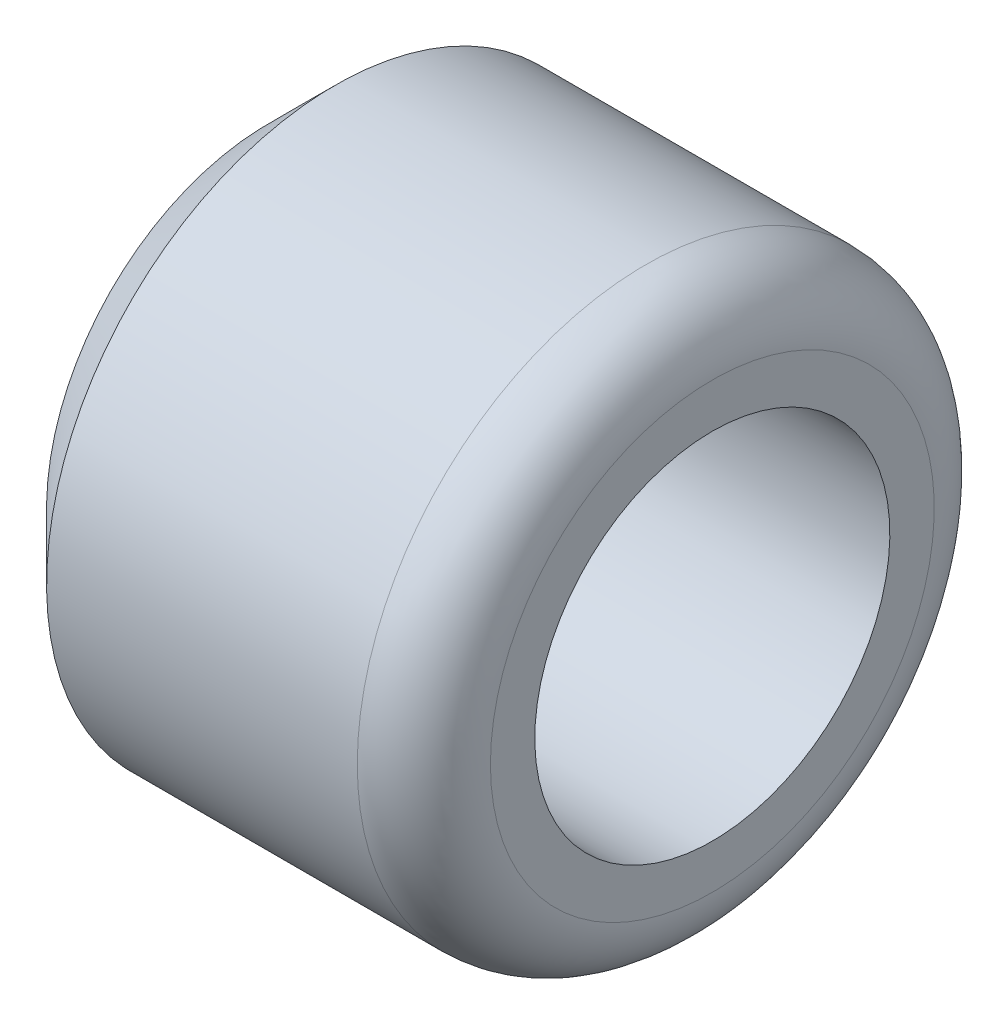
ISO-10303-21;
HEADER;
FILE_DESCRIPTION(('STEP AP214'),'2;1');
FILE_NAME('part.step','',(''),(''),'','','');
FILE_SCHEMA(('AUTOMOTIVE_DESIGN { 1 0 10303 214 1 1 1 1 }'));
ENDSEC;
DATA;
#1=APPLICATION_CONTEXT('core data for automotive mechanical design processes');
#2=APPLICATION_PROTOCOL_DEFINITION('international standard','automotive_design',2000,#1);
#3=PRODUCT_CONTEXT('',#1,'mechanical');
#4=PRODUCT('Part','Part','',(#3));
#5=PRODUCT_RELATED_PRODUCT_CATEGORY('part','',(#4));
#6=PRODUCT_DEFINITION_FORMATION('','',#4);
#7=PRODUCT_DEFINITION_CONTEXT('part definition',#1,'design');
#8=PRODUCT_DEFINITION('design','',#6,#7);
#9=PRODUCT_DEFINITION_SHAPE('','',#8);
#10=(LENGTH_UNIT() NAMED_UNIT(*) SI_UNIT(.MILLI.,.METRE.));
#11=(NAMED_UNIT(*) PLANE_ANGLE_UNIT() SI_UNIT($,.RADIAN.));
#12=(NAMED_UNIT(*) SI_UNIT($,.STERADIAN.) SOLID_ANGLE_UNIT());
#13=UNCERTAINTY_MEASURE_WITH_UNIT(LENGTH_MEASURE(1.E-05),#10,'distance_accuracy_value','');
#14=(GEOMETRIC_REPRESENTATION_CONTEXT(3) GLOBAL_UNCERTAINTY_ASSIGNED_CONTEXT((#13)) GLOBAL_UNIT_ASSIGNED_CONTEXT((#10,
#11,#12)) REPRESENTATION_CONTEXT('',''));
#15=CARTESIAN_POINT('',(0.,0.,0.));
#16=DIRECTION('',(0.,0.,1.));
#17=DIRECTION('',(1.,0.,0.));
#18=AXIS2_PLACEMENT_3D('',#15,#16,#17);
#19=CARTESIAN_POINT('',(3.,0.,0.));
#20=DIRECTION('',(-1.,0.,0.));
#21=DIRECTION('',(0.,0.,1.));
#22=AXIS2_PLACEMENT_3D('',#19,#20,#21);
#23=PLANE('',#22);
#24=CARTESIAN_POINT('',(3.,0.,0.));
#25=DIRECTION('',(-1.,0.,0.));
#26=DIRECTION('',(0.,1.,0.));
#27=AXIS2_PLACEMENT_3D('',#24,#25,#26);
#28=CIRCLE('',#27,2.25);
#29=CARTESIAN_POINT('',(3.,-2.25,0.));
#30=VERTEX_POINT('',#29);
#31=EDGE_CURVE('E119',#30,#30,#28,.T.);
#32=ORIENTED_EDGE('',*,*,#31,.T.);
#33=EDGE_LOOP('',(#32));
#34=FACE_BOUND('',#33,.T.);
#35=CARTESIAN_POINT('',(3.,0.,0.));
#36=DIRECTION('',(-1.,0.,0.));
#37=DIRECTION('',(0.,-1.,0.));
#38=AXIS2_PLACEMENT_3D('',#35,#36,#37);
#39=CIRCLE('',#38,4.);
#40=CARTESIAN_POINT('',(3.,4.,0.));
#41=VERTEX_POINT('',#40);
#42=EDGE_CURVE('E20',#41,#41,#39,.T.);
#43=ORIENTED_EDGE('',*,*,#42,.F.);
#44=EDGE_LOOP('',(#43));
#45=FACE_BOUND('',#44,.T.);
#46=ADVANCED_FACE('F17',(#34,#45),#23,.F.);
#47=CARTESIAN_POINT('',(3.,0.,0.));
#48=DIRECTION('',(1.,0.,0.));
#49=DIRECTION('',(0.,-1.,0.));
#50=AXIS2_PLACEMENT_3D('',#47,#48,#49);
#51=CYLINDRICAL_SURFACE('',#50,4.);
#52=ORIENTED_EDGE('',*,*,#42,.T.);
#53=DIRECTION('',(1.,0.,0.));
#54=VECTOR('',#53,1.);
#55=CARTESIAN_POINT('',(3.,4.,0.));
#56=LINE('',#55,#54);
#57=CARTESIAN_POINT('',(10.,4.,0.));
#58=VERTEX_POINT('',#57);
#59=EDGE_CURVE('E11',#41,#58,#56,.T.);
#60=ORIENTED_EDGE('',*,*,#59,.T.);
#61=CARTESIAN_POINT('',(10.,0.,0.));
#62=DIRECTION('',(-1.,0.,0.));
#63=DIRECTION('',(0.,-1.,0.));
#64=AXIS2_PLACEMENT_3D('',#61,#62,#63);
#65=CIRCLE('',#64,4.);
#66=EDGE_CURVE('E124',#58,#58,#65,.T.);
#67=ORIENTED_EDGE('',*,*,#66,.F.);
#68=ORIENTED_EDGE('',*,*,#59,.F.);
#69=EDGE_LOOP('',(#52,#60,#67,#68));
#70=FACE_BOUND('',#69,.T.);
#71=ADVANCED_FACE('F151',(#70),#51,.F.);
#72=CARTESIAN_POINT('',(3.,0.,0.));
#73=DIRECTION('',(-1.,0.,0.));
#74=DIRECTION('',(0.,1.,0.));
#75=AXIS2_PLACEMENT_3D('',#72,#73,#74);
#76=CYLINDRICAL_SURFACE('',#75,2.25);
#77=ORIENTED_EDGE('',*,*,#31,.F.);
#78=DIRECTION('',(-1.,0.,0.));
#79=VECTOR('',#78,1.);
#80=CARTESIAN_POINT('',(3.,-2.25,0.));
#81=LINE('',#80,#79);
#82=CARTESIAN_POINT('',(0.,-2.25,0.));
#83=VERTEX_POINT('',#82);
#84=EDGE_CURVE('E59',#30,#83,#81,.T.);
#85=ORIENTED_EDGE('',*,*,#84,.T.);
#86=CARTESIAN_POINT('',(0.,0.,0.));
#87=DIRECTION('',(1.,0.,0.));
#88=DIRECTION('',(0.,1.,0.));
#89=AXIS2_PLACEMENT_3D('',#86,#87,#88);
#90=CIRCLE('',#89,2.25);
#91=EDGE_CURVE('E112',#83,#83,#90,.T.);
#92=ORIENTED_EDGE('',*,*,#91,.F.);
#93=ORIENTED_EDGE('',*,*,#84,.F.);
#94=EDGE_LOOP('',(#77,#85,#92,#93));
#95=FACE_BOUND('',#94,.T.);
#96=ADVANCED_FACE('F133',(#95),#76,.F.);
#97=CARTESIAN_POINT('',(10.,0.,0.));
#98=DIRECTION('',(1.,0.,0.));
#99=DIRECTION('',(0.,1.,0.));
#100=AXIS2_PLACEMENT_3D('',#97,#98,#99);
#101=PLANE('',#100);
#102=ORIENTED_EDGE('',*,*,#66,.T.);
#103=EDGE_LOOP('',(#102));
#104=FACE_BOUND('',#103,.T.);
#105=CARTESIAN_POINT('',(10.,0.,0.));
#106=DIRECTION('',(-1.,0.,0.));
#107=DIRECTION('',(0.,1.,0.));
#108=AXIS2_PLACEMENT_3D('',#105,#106,#107);
#109=CIRCLE('',#108,5.);
#110=CARTESIAN_POINT('',(10.,0.,5.));
#111=VERTEX_POINT('',#110);
#112=EDGE_CURVE('E109',#111,#111,#109,.T.);
#113=ORIENTED_EDGE('',*,*,#112,.F.);
#114=EDGE_LOOP('',(#113));
#115=FACE_BOUND('',#114,.T.);
#116=ADVANCED_FACE('F147',(#104,#115),#101,.T.);
#117=CARTESIAN_POINT('',(8.5,0.,0.));
#118=DIRECTION('',(1.,0.,0.));
#119=DIRECTION('',(0.,0.,-1.));
#120=AXIS2_PLACEMENT_3D('',#117,#118,#119);
#121=TOROIDAL_SURFACE('',#120,5.,1.5);
#122=ORIENTED_EDGE('',*,*,#112,.T.);
#123=CARTESIAN_POINT('',(8.5,0.,5.));
#124=DIRECTION('',(0.,-1.,0.));
#125=DIRECTION('',(0.,0.,1.));
#126=AXIS2_PLACEMENT_3D('',#123,#124,#125);
#127=CIRCLE('',#126,1.5);
#128=CARTESIAN_POINT('',(8.5,0.,6.5));
#129=VERTEX_POINT('',#128);
#130=EDGE_CURVE('E52',#111,#129,#127,.T.);
#131=ORIENTED_EDGE('',*,*,#130,.T.);
#132=CARTESIAN_POINT('',(8.5,0.,0.));
#133=DIRECTION('',(1.,0.,0.));
#134=DIRECTION('',(0.,1.,0.));
#135=AXIS2_PLACEMENT_3D('',#132,#133,#134);
#136=CIRCLE('',#135,6.5);
#137=CARTESIAN_POINT('',(8.5,-6.5,0.));
#138=VERTEX_POINT('',#137);
#139=EDGE_CURVE('E95',#129,#138,#136,.T.);
#140=ORIENTED_EDGE('',*,*,#139,.T.);
#141=CARTESIAN_POINT('',(8.5,0.,0.));
#142=DIRECTION('',(1.,0.,0.));
#143=DIRECTION('',(0.,1.,0.));
#144=AXIS2_PLACEMENT_3D('',#141,#142,#143);
#145=CIRCLE('',#144,6.5);
#146=EDGE_CURVE('E93',#138,#129,#145,.T.);
#147=ORIENTED_EDGE('',*,*,#146,.T.);
#148=ORIENTED_EDGE('',*,*,#130,.F.);
#149=EDGE_LOOP('',(#122,#131,#140,#147,#148));
#150=FACE_BOUND('',#149,.T.);
#151=ADVANCED_FACE('F138',(#150),#121,.T.);
#152=CARTESIAN_POINT('',(0.,0.,0.));
#153=DIRECTION('',(1.,0.,0.));
#154=DIRECTION('',(0.,1.,0.));
#155=AXIS2_PLACEMENT_3D('',#152,#153,#154);
#156=PLANE('',#155);
#157=ORIENTED_EDGE('',*,*,#91,.T.);
#158=EDGE_LOOP('',(#157));
#159=FACE_BOUND('',#158,.T.);
#160=CARTESIAN_POINT('',(0.,0.,0.));
#161=DIRECTION('',(1.,0.,0.));
#162=DIRECTION('',(0.,1.,0.));
#163=AXIS2_PLACEMENT_3D('',#160,#161,#162);
#164=CIRCLE('',#163,5.);
#165=CARTESIAN_POINT('',(0.,-5.,0.));
#166=VERTEX_POINT('',#165);
#167=EDGE_CURVE('E81',#166,#166,#164,.T.);
#168=ORIENTED_EDGE('',*,*,#167,.F.);
#169=EDGE_LOOP('',(#168));
#170=FACE_BOUND('',#169,.T.);
#171=ADVANCED_FACE('F135',(#159,#170),#156,.F.);
#172=CARTESIAN_POINT('',(0.,0.,0.));
#173=DIRECTION('',(1.,0.,0.));
#174=DIRECTION('',(0.,1.,0.));
#175=AXIS2_PLACEMENT_3D('',#172,#173,#174);
#176=CYLINDRICAL_SURFACE('',#175,6.5);
#177=ORIENTED_EDGE('',*,*,#146,.F.);
#178=DIRECTION('',(-1.,0.,0.));
#179=VECTOR('',#178,1.);
#180=CARTESIAN_POINT('',(0.,-6.5,0.));
#181=LINE('',#180,#179);
#182=CARTESIAN_POINT('',(1.5,-6.5,0.));
#183=VERTEX_POINT('',#182);
#184=EDGE_CURVE('E89',#138,#183,#181,.T.);
#185=ORIENTED_EDGE('',*,*,#184,.T.);
#186=CARTESIAN_POINT('',(1.5,0.,0.));
#187=DIRECTION('',(-1.,0.,0.));
#188=DIRECTION('',(0.,1.,0.));
#189=AXIS2_PLACEMENT_3D('',#186,#187,#188);
#190=CIRCLE('',#189,6.5);
#191=EDGE_CURVE('E92',#183,#183,#190,.T.);
#192=ORIENTED_EDGE('',*,*,#191,.F.);
#193=ORIENTED_EDGE('',*,*,#184,.F.);
#194=ORIENTED_EDGE('',*,*,#139,.F.);
#195=EDGE_LOOP('',(#177,#185,#192,#193,#194));
#196=FACE_BOUND('',#195,.T.);
#197=ADVANCED_FACE('F90',(#196),#176,.T.);
#198=CARTESIAN_POINT('',(0.75,0.,0.));
#199=DIRECTION('',(1.,0.,0.));
#200=DIRECTION('',(0.,1.,0.));
#201=AXIS2_PLACEMENT_3D('',#198,#199,#200);
#202=CONICAL_SURFACE('',#201,5.75,0.785398163397448);
#203=ORIENTED_EDGE('',*,*,#191,.T.);
#204=DIRECTION('',(-0.707106781186548,0.707106781186548,0.));
#205=VECTOR('',#204,1.);
#206=CARTESIAN_POINT('',(0.75,-5.75,0.));
#207=LINE('',#206,#205);
#208=EDGE_CURVE('E97',#183,#166,#207,.T.);
#209=ORIENTED_EDGE('',*,*,#208,.T.);
#210=ORIENTED_EDGE('',*,*,#167,.T.);
#211=ORIENTED_EDGE('',*,*,#208,.F.);
#212=EDGE_LOOP('',(#203,#209,#210,#211));
#213=FACE_BOUND('',#212,.T.);
#214=ADVANCED_FACE('F98',(#213),#202,.T.);
#215=CLOSED_SHELL('',(#46,#71,#96,#116,#151,#171,#197,#214));
#216=MANIFOLD_SOLID_BREP('B1',#215);
#217=ADVANCED_BREP_SHAPE_REPRESENTATION('',(#18,#216),#14);
#218=SHAPE_DEFINITION_REPRESENTATION(#9,#217);
ENDSEC;
END-ISO-10303-21;
